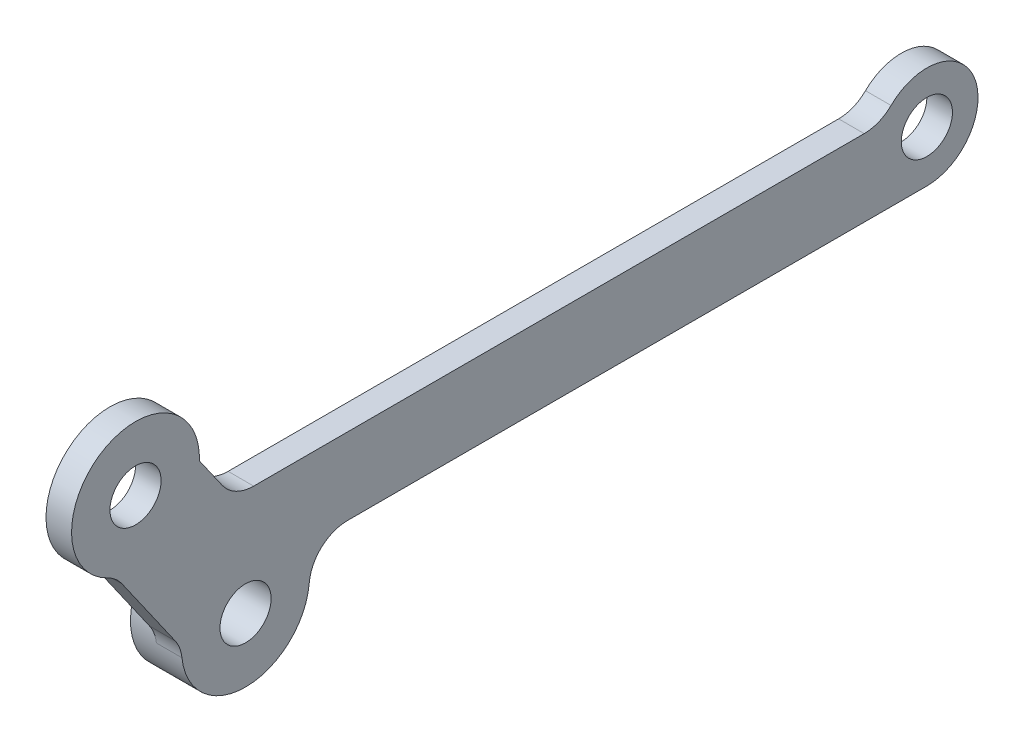
ISO-10303-21;
HEADER;
FILE_DESCRIPTION(('STEP AP214'),'2;1');
FILE_NAME('part.step','',(''),(''),'','','');
FILE_SCHEMA(('AUTOMOTIVE_DESIGN { 1 0 10303 214 1 1 1 1 }'));
ENDSEC;
DATA;
#1=APPLICATION_CONTEXT('core data for automotive mechanical design processes');
#2=APPLICATION_PROTOCOL_DEFINITION('international standard','automotive_design',2000,#1);
#3=PRODUCT_CONTEXT('',#1,'mechanical');
#4=PRODUCT('Part','Part','',(#3));
#5=PRODUCT_RELATED_PRODUCT_CATEGORY('part','',(#4));
#6=PRODUCT_DEFINITION_FORMATION('','',#4);
#7=PRODUCT_DEFINITION_CONTEXT('part definition',#1,'design');
#8=PRODUCT_DEFINITION('design','',#6,#7);
#9=PRODUCT_DEFINITION_SHAPE('','',#8);
#10=(LENGTH_UNIT() NAMED_UNIT(*) SI_UNIT(.MILLI.,.METRE.));
#11=(NAMED_UNIT(*) PLANE_ANGLE_UNIT() SI_UNIT($,.RADIAN.));
#12=(NAMED_UNIT(*) SI_UNIT($,.STERADIAN.) SOLID_ANGLE_UNIT());
#13=UNCERTAINTY_MEASURE_WITH_UNIT(LENGTH_MEASURE(1.E-05),#10,'distance_accuracy_value','');
#14=(GEOMETRIC_REPRESENTATION_CONTEXT(3) GLOBAL_UNCERTAINTY_ASSIGNED_CONTEXT((#13)) GLOBAL_UNIT_ASSIGNED_CONTEXT((#10,
#11,#12)) REPRESENTATION_CONTEXT('',''));
#15=CARTESIAN_POINT('',(0.,0.,0.));
#16=DIRECTION('',(0.,0.,1.));
#17=DIRECTION('',(1.,0.,0.));
#18=AXIS2_PLACEMENT_3D('',#15,#16,#17);
#19=CARTESIAN_POINT('',(2.,0.,0.));
#20=DIRECTION('',(0.,1.,0.));
#21=DIRECTION('',(0.,0.,1.));
#22=AXIS2_PLACEMENT_3D('',#19,#20,#21);
#23=PLANE('',#22);
#24=DIRECTION('',(0.,0.,-1.));
#25=VECTOR('',#24,1.);
#26=CARTESIAN_POINT('',(2.,0.,0.));
#27=LINE('',#26,#25);
#28=CARTESIAN_POINT('',(2.,0.,-1.56170115165524));
#29=VERTEX_POINT('',#28);
#30=CARTESIAN_POINT('',(2.,0.,-49.3022657436919));
#31=VERTEX_POINT('',#30);
#32=EDGE_CURVE('E237',#29,#31,#27,.T.);
#33=ORIENTED_EDGE('',*,*,#32,.T.);
#34=DIRECTION('',(-1.,0.,0.));
#35=VECTOR('',#34,1.);
#36=CARTESIAN_POINT('',(2.,0.,-49.3022657436919));
#37=LINE('',#36,#35);
#38=CARTESIAN_POINT('',(0.,0.,-49.3022657436919));
#39=VERTEX_POINT('',#38);
#40=EDGE_CURVE('E271',#31,#39,#37,.T.);
#41=ORIENTED_EDGE('',*,*,#40,.T.);
#42=DIRECTION('',(0.,0.,-1.));
#43=VECTOR('',#42,1.);
#44=CARTESIAN_POINT('',(0.,0.,0.));
#45=LINE('',#44,#43);
#46=CARTESIAN_POINT('',(0.,0.,-1.56170115165524));
#47=VERTEX_POINT('',#46);
#48=EDGE_CURVE('E267',#47,#39,#45,.T.);
#49=ORIENTED_EDGE('',*,*,#48,.F.);
#50=DIRECTION('',(-1.,0.,0.));
#51=VECTOR('',#50,1.);
#52=CARTESIAN_POINT('',(2.,0.,-1.56170115165524));
#53=LINE('',#52,#51);
#54=EDGE_CURVE('E247',#47,#29,#53,.F.);
#55=ORIENTED_EDGE('',*,*,#54,.T.);
#56=EDGE_LOOP('',(#33,#41,#49,#55));
#57=FACE_BOUND('',#56,.T.);
#58=ADVANCED_FACE('F134',(#57),#23,.T.);
#59=CARTESIAN_POINT('',(2.,-6.,0.));
#60=DIRECTION('',(0.,1.,0.));
#61=DIRECTION('',(0.,0.,1.));
#62=AXIS2_PLACEMENT_3D('',#59,#60,#61);
#63=PLANE('',#62);
#64=DIRECTION('',(0.,0.,-1.));
#65=VECTOR('',#64,1.);
#66=CARTESIAN_POINT('',(2.,-6.,0.));
#67=LINE('',#66,#65);
#68=CARTESIAN_POINT('',(2.,-6.,-8.89345099264765));
#69=VERTEX_POINT('',#68);
#70=CARTESIAN_POINT('',(2.,-6.,-54.2012452292583));
#71=VERTEX_POINT('',#70);
#72=EDGE_CURVE('E223',#69,#71,#67,.T.);
#73=ORIENTED_EDGE('',*,*,#72,.F.);
#74=DIRECTION('',(1.,0.,0.));
#75=VECTOR('',#74,1.);
#76=CARTESIAN_POINT('',(0.,-6.,-8.89345099264765));
#77=LINE('',#76,#75);
#78=CARTESIAN_POINT('',(0.,-6.,-8.89345099264765));
#79=VERTEX_POINT('',#78);
#80=EDGE_CURVE('E294',#69,#79,#77,.F.);
#81=ORIENTED_EDGE('',*,*,#80,.T.);
#82=DIRECTION('',(0.,0.,-1.));
#83=VECTOR('',#82,1.);
#84=CARTESIAN_POINT('',(0.,-6.,0.));
#85=LINE('',#84,#83);
#86=CARTESIAN_POINT('',(0.,-6.,-54.2012452292583));
#87=VERTEX_POINT('',#86);
#88=EDGE_CURVE('E242',#79,#87,#85,.T.);
#89=ORIENTED_EDGE('',*,*,#88,.T.);
#90=DIRECTION('',(-1.,0.,0.));
#91=VECTOR('',#90,1.);
#92=CARTESIAN_POINT('',(2.,-6.,-54.2012452292583));
#93=LINE('',#92,#91);
#94=EDGE_CURVE('E236',#71,#87,#93,.T.);
#95=ORIENTED_EDGE('',*,*,#94,.F.);
#96=EDGE_LOOP('',(#73,#81,#89,#95));
#97=FACE_BOUND('',#96,.T.);
#98=ADVANCED_FACE('F240',(#97),#63,.F.);
#99=CARTESIAN_POINT('',(0.,0.,0.));
#100=DIRECTION('',(1.,0.,0.));
#101=DIRECTION('',(0.,0.,-1.));
#102=AXIS2_PLACEMENT_3D('',#99,#100,#101);
#103=PLANE('',#102);
#104=CARTESIAN_POINT('',(0.,3.99297491893071,7.67900949316339));
#105=DIRECTION('',(1.,0.,0.));
#106=DIRECTION('',(0.,0.,-1.));
#107=AXIS2_PLACEMENT_3D('',#104,#105,#106);
#108=CIRCLE('',#107,2.);
#109=CARTESIAN_POINT('',(0.,3.99297491893071,5.67900949316339));
#110=VERTEX_POINT('',#109);
#111=EDGE_CURVE('E366',#110,#110,#108,.F.);
#112=ORIENTED_EDGE('',*,*,#111,.F.);
#113=EDGE_LOOP('',(#112));
#114=FACE_BOUND('',#113,.T.);
#115=CARTESIAN_POINT('',(0.,-2.,-54.2012452292583));
#116=DIRECTION('',(1.,0.,0.));
#117=DIRECTION('',(0.,0.,-1.));
#118=AXIS2_PLACEMENT_3D('',#115,#116,#117);
#119=CIRCLE('',#118,2.);
#120=CARTESIAN_POINT('',(0.,-2.,-56.2012452292583));
#121=VERTEX_POINT('',#120);
#122=EDGE_CURVE('E373',#121,#121,#119,.F.);
#123=ORIENTED_EDGE('',*,*,#122,.F.);
#124=EDGE_LOOP('',(#123));
#125=FACE_BOUND('',#124,.T.);
#126=ORIENTED_EDGE('',*,*,#88,.F.);
#127=CARTESIAN_POINT('',(0.,-9.,-8.89345099264765));
#128=DIRECTION('',(1.,0.,0.));
#129=DIRECTION('',(0.,0.,-1.));
#130=AXIS2_PLACEMENT_3D('',#127,#128,#129);
#131=CIRCLE('',#130,3.);
#132=CARTESIAN_POINT('',(0.,-8.73536465452657,-5.90514576494314));
#133=VERTEX_POINT('',#132);
#134=EDGE_CURVE('E318',#79,#133,#131,.T.);
#135=ORIENTED_EDGE('',*,*,#134,.T.);
#136=CARTESIAN_POINT('',(0.,-8.29430574540418,-0.924637052102279));
#137=DIRECTION('',(1.,0.,0.));
#138=DIRECTION('',(0.,0.,-1.));
#139=AXIS2_PLACEMENT_3D('',#136,#137,#138);
#140=CIRCLE('',#139,4.99999999999999);
#141=CARTESIAN_POINT('',(0.,-8.82085126347562,4.04756063276493));
#142=VERTEX_POINT('',#141);
#143=EDGE_CURVE('E363',#133,#142,#140,.T.);
#144=ORIENTED_EDGE('',*,*,#143,.T.);
#145=CARTESIAN_POINT('',(0.,-9.13677857431849,7.03087924368525));
#146=DIRECTION('',(1.,0.,0.));
#147=DIRECTION('',(0.,0.,-1.));
#148=AXIS2_PLACEMENT_3D('',#145,#146,#147);
#149=CIRCLE('',#148,3.);
#150=CARTESIAN_POINT('',(0.,-7.41604926526535,4.57342311081828));
#151=VERTEX_POINT('',#150);
#152=EDGE_CURVE('E306',#142,#151,#149,.T.);
#153=ORIENTED_EDGE('',*,*,#152,.T.);
#154=DIRECTION('',(0.,-0.819152044288993,-0.573576436351045));
#155=VECTOR('',#154,1.);
#156=CARTESIAN_POINT('',(0.,1.69866917352653,10.9556176703194));
#157=LINE('',#156,#155);
#158=CARTESIAN_POINT('',(0.,-1.47389305201649,8.73416568455478));
#159=VERTEX_POINT('',#158);
#160=EDGE_CURVE('E343',#159,#151,#157,.T.);
#161=ORIENTED_EDGE('',*,*,#160,.F.);
#162=CARTESIAN_POINT('',(0.,-3.19462236106962,11.1916218174218));
#163=DIRECTION('',(1.,0.,0.));
#164=DIRECTION('',(0.,0.,-1.));
#165=AXIS2_PLACEMENT_3D('',#162,#163,#164);
#166=CIRCLE('',#165,3.);
#167=CARTESIAN_POINT('',(0.,-0.499273381069496,9.87439219582487));
#168=VERTEX_POINT('',#167);
#169=EDGE_CURVE('E312',#159,#168,#166,.T.);
#170=ORIENTED_EDGE('',*,*,#169,.T.);
#171=CARTESIAN_POINT('',(0.,3.99297491893071,7.67900949316339));
#172=DIRECTION('',(1.,0.,0.));
#173=DIRECTION('',(0.,0.,-1.));
#174=AXIS2_PLACEMENT_3D('',#171,#172,#173);
#175=CIRCLE('',#174,4.99999999999999);
#176=CARTESIAN_POINT('',(0.,3.82982453146792,2.6816720069543));
#177=VERTEX_POINT('',#176);
#178=EDGE_CURVE('E348',#177,#168,#175,.T.);
#179=ORIENTED_EDGE('',*,*,#178,.F.);
#180=DIRECTION('',(0.,-0.819152044288992,-0.573576436351045));
#181=VECTOR('',#180,1.);
#182=CARTESIAN_POINT('',(0.,6.28728066433489,4.40240131600742));
#183=LINE('',#182,#181);
#184=CARTESIAN_POINT('',(0.,1.27927069094687,0.895754981211733));
#185=VERTEX_POINT('',#184);
#186=EDGE_CURVE('E258',#177,#185,#183,.T.);
#187=ORIENTED_EDGE('',*,*,#186,.T.);
#188=CARTESIAN_POINT('',(0.,3.,-1.56170115165524));
#189=DIRECTION('',(1.,0.,0.));
#190=DIRECTION('',(0.,0.,-1.));
#191=AXIS2_PLACEMENT_3D('',#188,#189,#190);
#192=CIRCLE('',#191,3.);
#193=EDGE_CURVE('E143',#185,#47,#192,.T.);
#194=ORIENTED_EDGE('',*,*,#193,.T.);
#195=ORIENTED_EDGE('',*,*,#48,.T.);
#196=CARTESIAN_POINT('',(0.,3.,-49.3022657436919));
#197=DIRECTION('',(1.,0.,0.));
#198=DIRECTION('',(0.,0.,-1.));
#199=AXIS2_PLACEMENT_3D('',#196,#197,#198);
#200=CIRCLE('',#199,3.);
#201=CARTESIAN_POINT('',(0.,0.857142857142855,-51.4018283803632));
#202=VERTEX_POINT('',#201);
#203=EDGE_CURVE('E300',#39,#202,#200,.T.);
#204=ORIENTED_EDGE('',*,*,#203,.T.);
#205=CARTESIAN_POINT('',(0.,-2.,-54.2012452292583));
#206=DIRECTION('',(1.,0.,0.));
#207=DIRECTION('',(0.,0.,-1.));
#208=AXIS2_PLACEMENT_3D('',#205,#206,#207);
#209=CIRCLE('',#208,3.99999999999999);
#210=EDGE_CURVE('E254',#87,#202,#209,.T.);
#211=ORIENTED_EDGE('',*,*,#210,.F.);
#212=EDGE_LOOP('',(#126,#135,#144,#153,#161,#170,#179,#187,#194,#195,#204,#211));
#213=FACE_BOUND('',#212,.T.);
#214=ADVANCED_FACE('F328',(#114,#125,#213),#103,.F.);
#215=CARTESIAN_POINT('',(2.,0.,0.));
#216=DIRECTION('',(1.,0.,0.));
#217=DIRECTION('',(0.,0.,-1.));
#218=AXIS2_PLACEMENT_3D('',#215,#216,#217);
#219=PLANE('',#218);
#220=CARTESIAN_POINT('',(2.,3.99297491893071,7.67900949316339));
#221=DIRECTION('',(1.,0.,0.));
#222=DIRECTION('',(0.,0.,-1.));
#223=AXIS2_PLACEMENT_3D('',#220,#221,#222);
#224=CIRCLE('',#223,2.);
#225=CARTESIAN_POINT('',(2.,3.99297491893071,5.67900949316339));
#226=VERTEX_POINT('',#225);
#227=EDGE_CURVE('E377',#226,#226,#224,.T.);
#228=ORIENTED_EDGE('',*,*,#227,.F.);
#229=EDGE_LOOP('',(#228));
#230=FACE_BOUND('',#229,.T.);
#231=CARTESIAN_POINT('',(2.,-8.29430574540418,-0.924637052102279));
#232=DIRECTION('',(1.,0.,0.));
#233=DIRECTION('',(0.,0.,-1.));
#234=AXIS2_PLACEMENT_3D('',#231,#232,#233);
#235=CIRCLE('',#234,2.);
#236=CARTESIAN_POINT('',(2.,-8.29430574540418,-2.92463705210228));
#237=VERTEX_POINT('',#236);
#238=EDGE_CURVE('E382',#237,#237,#235,.T.);
#239=ORIENTED_EDGE('',*,*,#238,.F.);
#240=EDGE_LOOP('',(#239));
#241=FACE_BOUND('',#240,.T.);
#242=CARTESIAN_POINT('',(2.,-2.,-54.2012452292583));
#243=DIRECTION('',(1.,0.,0.));
#244=DIRECTION('',(0.,0.,-1.));
#245=AXIS2_PLACEMENT_3D('',#242,#243,#244);
#246=CIRCLE('',#245,2.);
#247=CARTESIAN_POINT('',(2.,-2.,-56.2012452292583));
#248=VERTEX_POINT('',#247);
#249=EDGE_CURVE('E378',#248,#248,#246,.T.);
#250=ORIENTED_EDGE('',*,*,#249,.F.);
#251=EDGE_LOOP('',(#250));
#252=FACE_BOUND('',#251,.T.);
#253=CARTESIAN_POINT('',(2.,-8.29430574540418,-0.924637052102279));
#254=DIRECTION('',(1.,0.,0.));
#255=DIRECTION('',(0.,0.,-1.));
#256=AXIS2_PLACEMENT_3D('',#253,#254,#255);
#257=CIRCLE('',#256,4.99999999999999);
#258=CARTESIAN_POINT('',(2.,-8.82085126347562,4.04756063276493));
#259=VERTEX_POINT('',#258);
#260=CARTESIAN_POINT('',(2.,-8.73536465452657,-5.90514576494314));
#261=VERTEX_POINT('',#260);
#262=EDGE_CURVE('E253',#259,#261,#257,.T.);
#263=ORIENTED_EDGE('',*,*,#262,.T.);
#264=CARTESIAN_POINT('',(2.,-9.,-8.89345099264765));
#265=DIRECTION('',(1.,0.,0.));
#266=DIRECTION('',(0.,0.,-1.));
#267=AXIS2_PLACEMENT_3D('',#264,#265,#266);
#268=CIRCLE('',#267,3.);
#269=EDGE_CURVE('E231',#261,#69,#268,.F.);
#270=ORIENTED_EDGE('',*,*,#269,.T.);
#271=ORIENTED_EDGE('',*,*,#72,.T.);
#272=CARTESIAN_POINT('',(2.,-2.,-54.2012452292583));
#273=DIRECTION('',(1.,0.,0.));
#274=DIRECTION('',(0.,0.,-1.));
#275=AXIS2_PLACEMENT_3D('',#272,#273,#274);
#276=CIRCLE('',#275,3.99999999999999);
#277=CARTESIAN_POINT('',(2.,0.857142857142855,-51.4018283803632));
#278=VERTEX_POINT('',#277);
#279=EDGE_CURVE('E228',#71,#278,#276,.T.);
#280=ORIENTED_EDGE('',*,*,#279,.T.);
#281=CARTESIAN_POINT('',(2.,3.,-49.3022657436919));
#282=DIRECTION('',(1.,0.,0.));
#283=DIRECTION('',(0.,0.,-1.));
#284=AXIS2_PLACEMENT_3D('',#281,#282,#283);
#285=CIRCLE('',#284,3.);
#286=EDGE_CURVE('E303',#278,#31,#285,.F.);
#287=ORIENTED_EDGE('',*,*,#286,.T.);
#288=ORIENTED_EDGE('',*,*,#32,.F.);
#289=CARTESIAN_POINT('',(2.,3.,-1.56170115165524));
#290=DIRECTION('',(1.,0.,0.));
#291=DIRECTION('',(0.,0.,-1.));
#292=AXIS2_PLACEMENT_3D('',#289,#290,#291);
#293=CIRCLE('',#292,3.);
#294=CARTESIAN_POINT('',(2.,1.27927069094687,0.895754981211733));
#295=VERTEX_POINT('',#294);
#296=EDGE_CURVE('E12',#29,#295,#293,.F.);
#297=ORIENTED_EDGE('',*,*,#296,.T.);
#298=DIRECTION('',(0.,-0.819152044288992,-0.573576436351045));
#299=VECTOR('',#298,1.);
#300=CARTESIAN_POINT('',(2.,6.28728066433489,4.40240131600742));
#301=LINE('',#300,#299);
#302=CARTESIAN_POINT('',(2.,3.82982453146792,2.6816720069543));
#303=VERTEX_POINT('',#302);
#304=EDGE_CURVE('E338',#303,#295,#301,.T.);
#305=ORIENTED_EDGE('',*,*,#304,.F.);
#306=CARTESIAN_POINT('',(2.,3.99297491893071,7.67900949316339));
#307=DIRECTION('',(1.,0.,0.));
#308=DIRECTION('',(0.,0.,-1.));
#309=AXIS2_PLACEMENT_3D('',#306,#307,#308);
#310=CIRCLE('',#309,4.99999999999999);
#311=CARTESIAN_POINT('',(2.,-0.499273381069496,9.87439219582487));
#312=VERTEX_POINT('',#311);
#313=EDGE_CURVE('E268',#303,#312,#310,.T.);
#314=ORIENTED_EDGE('',*,*,#313,.T.);
#315=CARTESIAN_POINT('',(2.,-3.19462236106962,11.1916218174218));
#316=DIRECTION('',(1.,0.,0.));
#317=DIRECTION('',(0.,0.,-1.));
#318=AXIS2_PLACEMENT_3D('',#315,#316,#317);
#319=CIRCLE('',#318,3.);
#320=CARTESIAN_POINT('',(2.,-1.47389305201649,8.73416568455478));
#321=VERTEX_POINT('',#320);
#322=EDGE_CURVE('E315',#312,#321,#319,.F.);
#323=ORIENTED_EDGE('',*,*,#322,.T.);
#324=DIRECTION('',(0.,-0.819152044288993,-0.573576436351045));
#325=VECTOR('',#324,1.);
#326=CARTESIAN_POINT('',(2.,1.69866917352653,10.9556176703194));
#327=LINE('',#326,#325);
#328=CARTESIAN_POINT('',(2.,-7.41604926526535,4.57342311081828));
#329=VERTEX_POINT('',#328);
#330=EDGE_CURVE('E342',#321,#329,#327,.T.);
#331=ORIENTED_EDGE('',*,*,#330,.T.);
#332=CARTESIAN_POINT('',(2.,-9.13677857431849,7.03087924368525));
#333=DIRECTION('',(1.,0.,0.));
#334=DIRECTION('',(0.,0.,-1.));
#335=AXIS2_PLACEMENT_3D('',#332,#333,#334);
#336=CIRCLE('',#335,3.);
#337=EDGE_CURVE('E309',#329,#259,#336,.F.);
#338=ORIENTED_EDGE('',*,*,#337,.T.);
#339=EDGE_LOOP('',(#263,#270,#271,#280,#287,#288,#297,#305,#314,#323,#331,#338));
#340=FACE_BOUND('',#339,.T.);
#341=ADVANCED_FACE('F226',(#230,#241,#252,#340),#219,.T.);
#342=CARTESIAN_POINT('',(2.,-2.,-54.2012452292583));
#343=DIRECTION('',(-1.,0.,0.));
#344=DIRECTION('',(0.,0.,1.));
#345=AXIS2_PLACEMENT_3D('',#342,#343,#344);
#346=CYLINDRICAL_SURFACE('',#345,3.99999999999999);
#347=ORIENTED_EDGE('',*,*,#210,.T.);
#348=DIRECTION('',(-1.,0.,0.));
#349=VECTOR('',#348,1.);
#350=CARTESIAN_POINT('',(2.,0.857142857142855,-51.4018283803632));
#351=LINE('',#350,#349);
#352=EDGE_CURVE('E251',#202,#278,#351,.F.);
#353=ORIENTED_EDGE('',*,*,#352,.T.);
#354=ORIENTED_EDGE('',*,*,#279,.F.);
#355=ORIENTED_EDGE('',*,*,#94,.T.);
#356=EDGE_LOOP('',(#347,#353,#354,#355));
#357=FACE_BOUND('',#356,.T.);
#358=ADVANCED_FACE('F249',(#357),#346,.T.);
#359=CARTESIAN_POINT('',(2.,3.99297491893071,7.67900949316339));
#360=DIRECTION('',(-1.,0.,0.));
#361=DIRECTION('',(0.,0.,1.));
#362=AXIS2_PLACEMENT_3D('',#359,#360,#361);
#363=CYLINDRICAL_SURFACE('',#362,4.99999999999999);
#364=ORIENTED_EDGE('',*,*,#178,.T.);
#365=DIRECTION('',(-1.,0.,0.));
#366=VECTOR('',#365,1.);
#367=CARTESIAN_POINT('',(2.,-0.499273381069497,9.87439219582487));
#368=LINE('',#367,#366);
#369=EDGE_CURVE('E291',#168,#312,#368,.F.);
#370=ORIENTED_EDGE('',*,*,#369,.T.);
#371=ORIENTED_EDGE('',*,*,#313,.F.);
#372=DIRECTION('',(-1.,0.,0.));
#373=VECTOR('',#372,1.);
#374=CARTESIAN_POINT('',(2.,3.82982453146792,2.6816720069543));
#375=LINE('',#374,#373);
#376=EDGE_CURVE('E264',#303,#177,#375,.T.);
#377=ORIENTED_EDGE('',*,*,#376,.T.);
#378=EDGE_LOOP('',(#364,#370,#371,#377));
#379=FACE_BOUND('',#378,.T.);
#380=ADVANCED_FACE('F424',(#379),#363,.T.);
#381=CARTESIAN_POINT('',(2.,6.28728066433489,4.40240131600742));
#382=DIRECTION('',(0.,0.573576436351045,-0.819152044288992));
#383=DIRECTION('',(0.,0.819152044288993,0.573576436351045));
#384=AXIS2_PLACEMENT_3D('',#381,#382,#383);
#385=PLANE('',#384);
#386=ORIENTED_EDGE('',*,*,#304,.T.);
#387=DIRECTION('',(-1.,0.,0.));
#388=VECTOR('',#387,1.);
#389=CARTESIAN_POINT('',(0.,1.27927069094686,0.895754981211733));
#390=LINE('',#389,#388);
#391=EDGE_CURVE('E297',#295,#185,#390,.T.);
#392=ORIENTED_EDGE('',*,*,#391,.T.);
#393=ORIENTED_EDGE('',*,*,#186,.F.);
#394=ORIENTED_EDGE('',*,*,#376,.F.);
#395=EDGE_LOOP('',(#386,#392,#393,#394));
#396=FACE_BOUND('',#395,.T.);
#397=ADVANCED_FACE('F337',(#396),#385,.T.);
#398=CARTESIAN_POINT('',(2.,1.69866917352653,10.9556176703194));
#399=DIRECTION('',(0.,0.573576436351045,-0.819152044288993));
#400=DIRECTION('',(0.,0.819152044288993,0.573576436351045));
#401=AXIS2_PLACEMENT_3D('',#398,#399,#400);
#402=PLANE('',#401);
#403=ORIENTED_EDGE('',*,*,#160,.T.);
#404=DIRECTION('',(1.,0.,0.));
#405=VECTOR('',#404,1.);
#406=CARTESIAN_POINT('',(2.,-7.41604926526535,4.57342311081828));
#407=LINE('',#406,#405);
#408=EDGE_CURVE('E288',#151,#329,#407,.T.);
#409=ORIENTED_EDGE('',*,*,#408,.T.);
#410=ORIENTED_EDGE('',*,*,#330,.F.);
#411=DIRECTION('',(1.,0.,0.));
#412=VECTOR('',#411,1.);
#413=CARTESIAN_POINT('',(0.,-1.47389305201649,8.73416568455478));
#414=LINE('',#413,#412);
#415=EDGE_CURVE('E284',#321,#159,#414,.F.);
#416=ORIENTED_EDGE('',*,*,#415,.T.);
#417=EDGE_LOOP('',(#403,#409,#410,#416));
#418=FACE_BOUND('',#417,.T.);
#419=ADVANCED_FACE('F428',(#418),#402,.F.);
#420=CARTESIAN_POINT('',(2.,-8.29430574540418,-0.924637052102279));
#421=DIRECTION('',(-1.,0.,0.));
#422=DIRECTION('',(0.,0.,1.));
#423=AXIS2_PLACEMENT_3D('',#420,#421,#422);
#424=CYLINDRICAL_SURFACE('',#423,4.99999999999999);
#425=ORIENTED_EDGE('',*,*,#262,.F.);
#426=DIRECTION('',(-1.,0.,0.));
#427=VECTOR('',#426,1.);
#428=CARTESIAN_POINT('',(2.,-8.82085126347562,4.04756063276493));
#429=LINE('',#428,#427);
#430=EDGE_CURVE('E280',#259,#142,#429,.T.);
#431=ORIENTED_EDGE('',*,*,#430,.T.);
#432=ORIENTED_EDGE('',*,*,#143,.F.);
#433=DIRECTION('',(-1.,0.,0.));
#434=VECTOR('',#433,1.);
#435=CARTESIAN_POINT('',(2.,-8.73536465452657,-5.90514576494314));
#436=LINE('',#435,#434);
#437=EDGE_CURVE('E277',#133,#261,#436,.F.);
#438=ORIENTED_EDGE('',*,*,#437,.T.);
#439=EDGE_LOOP('',(#425,#431,#432,#438));
#440=FACE_BOUND('',#439,.T.);
#441=CARTESIAN_POINT('',(-2.,-8.29430574540418,-0.924637052102279));
#442=DIRECTION('',(1.,0.,0.));
#443=DIRECTION('',(0.,0.,-1.));
#444=AXIS2_PLACEMENT_3D('',#441,#442,#443);
#445=CIRCLE('',#444,4.99999999999999);
#446=CARTESIAN_POINT('',(-2.,-8.29430574540418,-5.92463705210227));
#447=VERTEX_POINT('',#446);
#448=EDGE_CURVE('E260',#447,#447,#445,.T.);
#449=ORIENTED_EDGE('',*,*,#448,.T.);
#450=EDGE_LOOP('',(#449));
#451=FACE_BOUND('',#450,.T.);
#452=ADVANCED_FACE('F431',(#440,#451),#424,.T.);
#453=CARTESIAN_POINT('',(-2.,-8.29430574540418,-0.924637052102279));
#454=DIRECTION('',(1.,0.,0.));
#455=DIRECTION('',(0.,0.,-1.));
#456=AXIS2_PLACEMENT_3D('',#453,#454,#455);
#457=PLANE('',#456);
#458=CARTESIAN_POINT('',(-2.,-8.29430574540418,-0.924637052102279));
#459=DIRECTION('',(1.,0.,0.));
#460=DIRECTION('',(0.,0.,-1.));
#461=AXIS2_PLACEMENT_3D('',#458,#459,#460);
#462=CIRCLE('',#461,2.);
#463=CARTESIAN_POINT('',(-2.,-8.29430574540418,-2.92463705210228));
#464=VERTEX_POINT('',#463);
#465=EDGE_CURVE('E383',#464,#464,#462,.T.);
#466=ORIENTED_EDGE('',*,*,#465,.T.);
#467=EDGE_LOOP('',(#466));
#468=FACE_BOUND('',#467,.T.);
#469=ORIENTED_EDGE('',*,*,#448,.F.);
#470=EDGE_LOOP('',(#469));
#471=FACE_BOUND('',#470,.T.);
#472=ADVANCED_FACE('F437',(#468,#471),#457,.F.);
#473=CARTESIAN_POINT('',(2.,-8.29430574540418,-0.924637052102279));
#474=DIRECTION('',(-1.,0.,0.));
#475=DIRECTION('',(0.,0.,1.));
#476=AXIS2_PLACEMENT_3D('',#473,#474,#475);
#477=CYLINDRICAL_SURFACE('',#476,2.);
#478=ORIENTED_EDGE('',*,*,#238,.T.);
#479=EDGE_LOOP('',(#478));
#480=FACE_BOUND('',#479,.T.);
#481=ORIENTED_EDGE('',*,*,#465,.F.);
#482=EDGE_LOOP('',(#481));
#483=FACE_BOUND('',#482,.T.);
#484=ADVANCED_FACE('F407',(#480,#483),#477,.F.);
#485=CARTESIAN_POINT('',(2.,-2.,-54.2012452292583));
#486=DIRECTION('',(-1.,0.,0.));
#487=DIRECTION('',(0.,0.,1.));
#488=AXIS2_PLACEMENT_3D('',#485,#486,#487);
#489=CYLINDRICAL_SURFACE('',#488,2.);
#490=ORIENTED_EDGE('',*,*,#249,.T.);
#491=EDGE_LOOP('',(#490));
#492=FACE_BOUND('',#491,.T.);
#493=ORIENTED_EDGE('',*,*,#122,.T.);
#494=EDGE_LOOP('',(#493));
#495=FACE_BOUND('',#494,.T.);
#496=ADVANCED_FACE('F404',(#492,#495),#489,.F.);
#497=CARTESIAN_POINT('',(2.,3.99297491893071,7.67900949316339));
#498=DIRECTION('',(-1.,0.,0.));
#499=DIRECTION('',(0.,0.,1.));
#500=AXIS2_PLACEMENT_3D('',#497,#498,#499);
#501=CYLINDRICAL_SURFACE('',#500,2.);
#502=ORIENTED_EDGE('',*,*,#227,.T.);
#503=EDGE_LOOP('',(#502));
#504=FACE_BOUND('',#503,.T.);
#505=ORIENTED_EDGE('',*,*,#111,.T.);
#506=EDGE_LOOP('',(#505));
#507=FACE_BOUND('',#506,.T.);
#508=ADVANCED_FACE('F394',(#504,#507),#501,.F.);
#509=CARTESIAN_POINT('',(2.,3.,-49.3022657436919));
#510=DIRECTION('',(-1.,0.,0.));
#511=DIRECTION('',(0.,0.,1.));
#512=AXIS2_PLACEMENT_3D('',#509,#510,#511);
#513=CYLINDRICAL_SURFACE('',#512,3.);
#514=ORIENTED_EDGE('',*,*,#286,.F.);
#515=ORIENTED_EDGE('',*,*,#352,.F.);
#516=ORIENTED_EDGE('',*,*,#203,.F.);
#517=ORIENTED_EDGE('',*,*,#40,.F.);
#518=EDGE_LOOP('',(#514,#515,#516,#517));
#519=FACE_BOUND('',#518,.T.);
#520=ADVANCED_FACE('F441',(#519),#513,.F.);
#521=CARTESIAN_POINT('',(2.,-9.13677857431849,7.03087924368525));
#522=DIRECTION('',(-1.,0.,0.));
#523=DIRECTION('',(0.,0.,1.));
#524=AXIS2_PLACEMENT_3D('',#521,#522,#523);
#525=CYLINDRICAL_SURFACE('',#524,3.);
#526=ORIENTED_EDGE('',*,*,#337,.F.);
#527=ORIENTED_EDGE('',*,*,#408,.F.);
#528=ORIENTED_EDGE('',*,*,#152,.F.);
#529=ORIENTED_EDGE('',*,*,#430,.F.);
#530=EDGE_LOOP('',(#526,#527,#528,#529));
#531=FACE_BOUND('',#530,.T.);
#532=ADVANCED_FACE('F444',(#531),#525,.F.);
#533=CARTESIAN_POINT('',(2.,-3.19462236106962,11.1916218174218));
#534=DIRECTION('',(-1.,0.,0.));
#535=DIRECTION('',(0.,0.,1.));
#536=AXIS2_PLACEMENT_3D('',#533,#534,#535);
#537=CYLINDRICAL_SURFACE('',#536,3.);
#538=ORIENTED_EDGE('',*,*,#322,.F.);
#539=ORIENTED_EDGE('',*,*,#369,.F.);
#540=ORIENTED_EDGE('',*,*,#169,.F.);
#541=ORIENTED_EDGE('',*,*,#415,.F.);
#542=EDGE_LOOP('',(#538,#539,#540,#541));
#543=FACE_BOUND('',#542,.T.);
#544=ADVANCED_FACE('F448',(#543),#537,.F.);
#545=CARTESIAN_POINT('',(2.,-9.,-8.89345099264765));
#546=DIRECTION('',(-1.,0.,0.));
#547=DIRECTION('',(0.,0.,1.));
#548=AXIS2_PLACEMENT_3D('',#545,#546,#547);
#549=CYLINDRICAL_SURFACE('',#548,3.);
#550=ORIENTED_EDGE('',*,*,#269,.F.);
#551=ORIENTED_EDGE('',*,*,#437,.F.);
#552=ORIENTED_EDGE('',*,*,#134,.F.);
#553=ORIENTED_EDGE('',*,*,#80,.F.);
#554=EDGE_LOOP('',(#550,#551,#552,#553));
#555=FACE_BOUND('',#554,.T.);
#556=ADVANCED_FACE('F451',(#555),#549,.F.);
#557=CARTESIAN_POINT('',(2.,3.,-1.56170115165524));
#558=DIRECTION('',(1.,0.,0.));
#559=DIRECTION('',(0.,0.,-1.));
#560=AXIS2_PLACEMENT_3D('',#557,#558,#559);
#561=CYLINDRICAL_SURFACE('',#560,3.);
#562=ORIENTED_EDGE('',*,*,#296,.F.);
#563=ORIENTED_EDGE('',*,*,#54,.F.);
#564=ORIENTED_EDGE('',*,*,#193,.F.);
#565=ORIENTED_EDGE('',*,*,#391,.F.);
#566=EDGE_LOOP('',(#562,#563,#564,#565));
#567=FACE_BOUND('',#566,.T.);
#568=ADVANCED_FACE('F136',(#567),#561,.F.);
#569=CLOSED_SHELL('',(#58,#98,#214,#341,#358,#380,#397,#419,#452,#472,#484,#496,#508,#520,#532,
#544,#556,#568));
#570=MANIFOLD_SOLID_BREP('B2',#569);
#571=ADVANCED_BREP_SHAPE_REPRESENTATION('',(#18,#570),#14);
#572=SHAPE_DEFINITION_REPRESENTATION(#9,#571);
ENDSEC;
END-ISO-10303-21;
